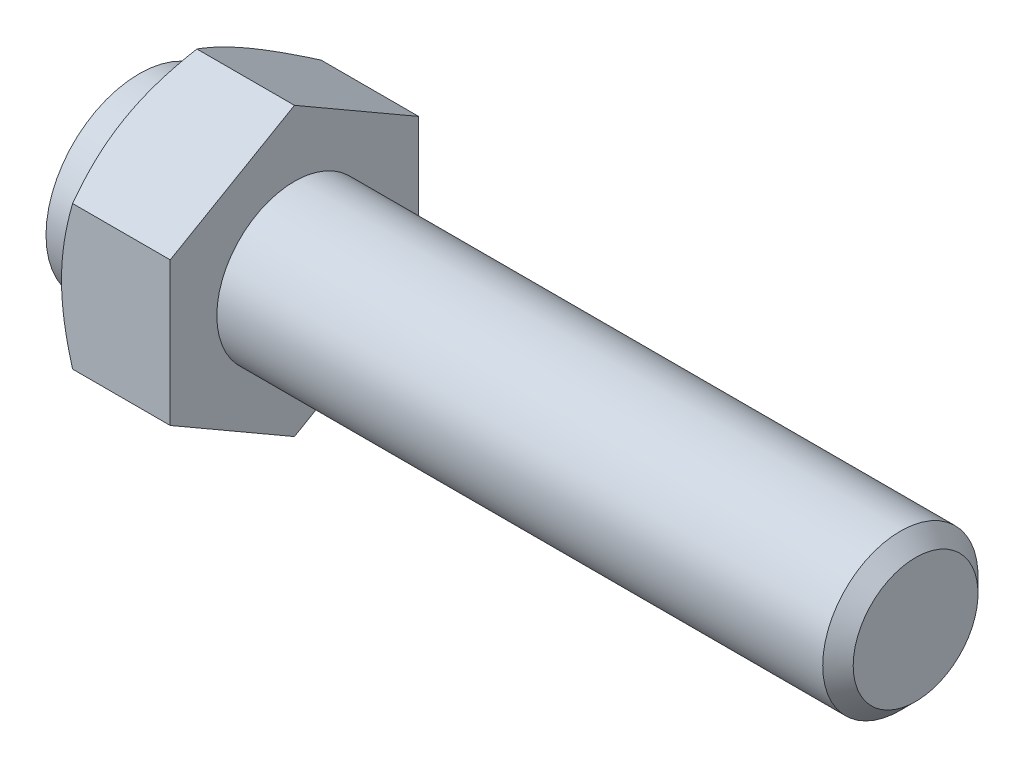
ISO-10303-21;
HEADER;
FILE_DESCRIPTION(('STEP AP214'),'2;1');
FILE_NAME('part.step','',(''),(''),'','','');
FILE_SCHEMA(('AUTOMOTIVE_DESIGN { 1 0 10303 214 1 1 1 1 }'));
ENDSEC;
DATA;
#1=APPLICATION_CONTEXT('core data for automotive mechanical design processes');
#2=APPLICATION_PROTOCOL_DEFINITION('international standard','automotive_design',2000,#1);
#3=PRODUCT_CONTEXT('',#1,'mechanical');
#4=PRODUCT('Part','Part','',(#3));
#5=PRODUCT_RELATED_PRODUCT_CATEGORY('part','',(#4));
#6=PRODUCT_DEFINITION_FORMATION('','',#4);
#7=PRODUCT_DEFINITION_CONTEXT('part definition',#1,'design');
#8=PRODUCT_DEFINITION('design','',#6,#7);
#9=PRODUCT_DEFINITION_SHAPE('','',#8);
#10=(LENGTH_UNIT() NAMED_UNIT(*) SI_UNIT(.MILLI.,.METRE.));
#11=(NAMED_UNIT(*) PLANE_ANGLE_UNIT() SI_UNIT($,.RADIAN.));
#12=(NAMED_UNIT(*) SI_UNIT($,.STERADIAN.) SOLID_ANGLE_UNIT());
#13=UNCERTAINTY_MEASURE_WITH_UNIT(LENGTH_MEASURE(1.E-05),#10,'distance_accuracy_value','');
#14=(GEOMETRIC_REPRESENTATION_CONTEXT(3) GLOBAL_UNCERTAINTY_ASSIGNED_CONTEXT((#13)) GLOBAL_UNIT_ASSIGNED_CONTEXT((#10,
#11,#12)) REPRESENTATION_CONTEXT('',''));
#15=CARTESIAN_POINT('',(0.,0.,0.));
#16=DIRECTION('',(0.,0.,1.));
#17=DIRECTION('',(1.,0.,0.));
#18=AXIS2_PLACEMENT_3D('',#15,#16,#17);
#19=CARTESIAN_POINT('',(-3.0381197846483,0.,0.));
#20=DIRECTION('',(1.,0.,0.));
#21=DIRECTION('',(0.,0.,-1.));
#22=AXIS2_PLACEMENT_3D('',#19,#20,#21);
#23=CONICAL_SURFACE('',#22,4.8,1.0471975511966);
#24=CARTESIAN_POINT('',(-1.57887075856018,-6.13939413294062,-4.));
#25=CARTESIAN_POINT('',(-1.66310456135238,-5.96521405575991,-4.));
#26=CARTESIAN_POINT('',(-1.74651196722149,-5.79062719131365,-4.));
#27=CARTESIAN_POINT('',(-1.91120786296766,-5.4404233088383,-4.));
#28=CARTESIAN_POINT('',(-1.99249600566285,-5.26480612772211,-4.));
#29=CARTESIAN_POINT('',(-2.15291001647983,-4.91138909620253,-4.));
#30=CARTESIAN_POINT('',(-2.23202112648226,-4.73358252336361,-4.));
#31=CARTESIAN_POINT('',(-2.38691919338497,-4.37653257309947,-4.));
#32=CARTESIAN_POINT('',(-2.46270631184629,-4.19728926600801,-4.));
#33=CARTESIAN_POINT('',(-2.61234069122834,-3.83154690304012,-4.));
#34=CARTESIAN_POINT('',(-2.68605704395078,-3.64499398861432,-4.));
#35=CARTESIAN_POINT('',(-2.82775411783597,-3.26968207246464,-4.));
#36=CARTESIAN_POINT('',(-2.89573418644737,-3.08092282252454,-4.));
#37=CARTESIAN_POINT('',(-3.02412704969833,-2.70127250879012,-4.));
#38=CARTESIAN_POINT('',(-3.08455573470301,-2.51038687463865,-4.));
#39=CARTESIAN_POINT('',(-3.19586469424676,-2.12587868357917,-4.));
#40=CARTESIAN_POINT('',(-3.24674804503767,-1.9322570301368,-4.));
#41=CARTESIAN_POINT('',(-3.33621571413744,-1.54322946382705,-4.));
#42=CARTESIAN_POINT('',(-3.37486428853927,-1.34783861004954,-4.));
#43=CARTESIAN_POINT('',(-3.43763422340833,-0.954695670395885,-4.));
#44=CARTESIAN_POINT('',(-3.46175683200502,-0.756943788878231,-4.));
#45=CARTESIAN_POINT('',(-3.49323359916261,-0.362621629692277,-4.));
#46=CARTESIAN_POINT('',(-3.50079822453623,-0.166068575033682,-4.));
#47=CARTESIAN_POINT('',(-3.49906790973023,0.226977102826042,-4.));
#48=CARTESIAN_POINT('',(-3.48977250832793,0.423469724226887,-4.));
#49=CARTESIAN_POINT('',(-3.4601531531514,0.758990273736847,-4.));
#50=CARTESIAN_POINT('',(-3.4437429725596,0.898383211053859,-4.));
#51=CARTESIAN_POINT('',(-3.40349476320339,1.176100092079,-4.));
#52=CARTESIAN_POINT('',(-3.37965566898105,1.31442387953113,-4.));
#53=CARTESIAN_POINT('',(-3.29825326079294,1.72763495504875,-4.));
#54=CARTESIAN_POINT('',(-3.23082125051095,2.00059716271885,-4.));
#55=CARTESIAN_POINT('',(-3.11451374843233,2.40866187771309,-4.));
#56=CARTESIAN_POINT('',(-3.07269287237421,2.54589494973043,-4.));
#57=CARTESIAN_POINT('',(-2.98486276665558,2.81902707997841,-4.));
#58=CARTESIAN_POINT('',(-2.93885351028714,2.9549261296963,-4.));
#59=CARTESIAN_POINT('',(-2.8433720179148,3.2254363287352,-4.));
#60=CARTESIAN_POINT('',(-2.79390102621893,3.36004792125236,-4.));
#61=CARTESIAN_POINT('',(-2.69206223773492,3.62816633823096,-4.));
#62=CARTESIAN_POINT('',(-2.63969446772329,3.76167317289117,-4.));
#63=CARTESIAN_POINT('',(-2.51762334906242,4.06475987665193,-4.));
#64=CARTESIAN_POINT('',(-2.447153932986,4.23403057744386,-4.));
#65=CARTESIAN_POINT('',(-2.30305911863712,4.57122630399105,-4.));
#66=CARTESIAN_POINT('',(-2.2294335680974,4.73915126435629,-4.));
#67=CARTESIAN_POINT('',(-2.00475288292283,5.24128493973559,-4.));
#68=CARTESIAN_POINT('',(-1.84991548479837,5.57379958004734,-4.));
#69=CARTESIAN_POINT('',(-1.53341711594573,6.2358945685597,-4.));
#70=CARTESIAN_POINT('',(-1.37175021882607,6.56547205474272,-4.));
#71=CARTESIAN_POINT('',(-1.04374298683518,7.22230103495156,-4.));
#72=CARTESIAN_POINT('',(-0.877402497289283,7.54955245154488,-4.));
#73=CARTESIAN_POINT('',(-0.5544646914537,8.17689265348599,-4.));
#74=CARTESIAN_POINT('',(-0.398118172737156,8.4771109692077,-4.));
#75=CARTESIAN_POINT('',(-0.0832622099771552,9.07642118538341,-4.));
#76=CARTESIAN_POINT('',(0.0752472970322567,9.375513052721,-4.));
#77=CARTESIAN_POINT('',(0.393577197351759,9.97215228024382,-4.));
#78=CARTESIAN_POINT('',(0.553393940840393,10.2697015905905,-4.));
#79=CARTESIAN_POINT('',(0.874341146801551,10.8640723738864,-4.));
#80=CARTESIAN_POINT('',(1.03547154464301,11.1608938817197,-4.));
#81=CARTESIAN_POINT('',(1.19709645417553,11.4574439973737,-4.));
#82=B_SPLINE_CURVE_WITH_KNOTS('',3,(#24,#25,#26,#27,#28,#29,#30,#31,#32,#33,#34,#35,#36,#37,#38,
#39,#40,#41,#42,#43,#44,#45,#46,#47,#48,#49,#50,#51,#52,#53,#54,#55,#56,#57,#58,#59,#60,#61,#62,
#63,#64,#65,#66,#67,#68,#69,#70,#71,#72,#73,#74,#75,#76,#77,#78,#79,#80,#81),.UNSPECIFIED.,.F.,
.F.,(4,2,2,2,2,2,2,2,2,2,2,2,2,2,2,2,2,2,2,2,2,2,2,2,2,2,2,2,4),(0.,0.580443710282804,
1.16098191997214,1.74479005581555,2.32856978442475,2.93026499507169,3.5320285616732,
4.13250371575107,4.73278501614091,5.32985927078347,5.92688221507966,6.51627129067316,
7.10567648982992,7.52653774537938,7.94745938882889,8.78979727003887,9.2201547358638,
9.65051494613078,10.0807212518396,10.5109235815821,11.0609419553601,11.610986894627,
12.7112482185919,13.8124847525737,14.9137577755076,15.9292165443316,16.9447049371325,
17.957959920125,18.9711653488122),.UNSPECIFIED.);
#83=CARTESIAN_POINT('',(-3.14273441009184,-2.3094010767585,-4.));
#84=VERTEX_POINT('',#83);
#85=CARTESIAN_POINT('',(-3.5,0.,-4.));
#86=VERTEX_POINT('',#85);
#87=EDGE_CURVE('E203',#84,#86,#82,.T.);
#88=ORIENTED_EDGE('',*,*,#87,.F.);
#89=CARTESIAN_POINT('',(-3.14266774092523,-4.61891762357084,0.000200000000000038));
#90=CARTESIAN_POINT('',(-3.20128212635172,-4.5174314838138,-0.175579150323228));
#91=CARTESIAN_POINT('',(-3.25458967853774,-4.41506932144052,-0.352875616326381));
#92=CARTESIAN_POINT('',(-3.3476383292536,-4.20857250547739,-0.710538593175707));
#93=CARTESIAN_POINT('',(-3.3873465109703,-4.10443418285647,-0.890911458970152));
#94=CARTESIAN_POINT('',(-3.44915778471972,-3.89744813015756,-1.24942181870279));
#95=CARTESIAN_POINT('',(-3.47167226847711,-3.79463224655059,-1.42750415293514));
#96=CARTESIAN_POINT('',(-3.49854937685342,-3.58851671999023,-1.78450671716651));
#97=CARTESIAN_POINT('',(-3.50293425857306,-3.48521782616117,-1.9634256496441));
#98=CARTESIAN_POINT('',(-3.49380992706003,-3.29219970504619,-2.29774284219673));
#99=CARTESIAN_POINT('',(-3.48254104601201,-3.20245157692486,-2.45319115998707));
#100=CARTESIAN_POINT('',(-3.44682600920181,-3.02354002635497,-2.76307505563506));
#101=CARTESIAN_POINT('',(-3.42236765428847,-2.93437722268073,-2.91750956174413));
#102=CARTESIAN_POINT('',(-3.36122393508071,-2.75509682012354,-3.22803232777458));
#103=CARTESIAN_POINT('',(-3.32427939634514,-2.6650019108942,-3.3840812880631));
#104=CARTESIAN_POINT('',(-3.24042992745197,-2.48615580200001,-3.69385183540384));
#105=CARTESIAN_POINT('',(-3.19354469778726,-2.39740231122585,-3.84757739077378));
#106=CARTESIAN_POINT('',(-3.14266774092523,-2.30928560670467,-4.0002));
#107=B_SPLINE_CURVE_WITH_KNOTS('',3,(#89,#90,#91,#92,#93,#94,#95,#96,#97,#98,#99,#100,#101,#102,
#103,#104,#105,#106),.UNSPECIFIED.,.F.,.F.,(4,2,2,2,2,2,2,2,4),(0.,0.634047835695967,
1.26961969224544,1.88946157213122,2.50854226669297,3.04757825393386,3.58711366126903,
4.13861653143764,4.68903648037743),.UNSPECIFIED.);
#108=CARTESIAN_POINT('',(-3.5,-3.46410161513776,-2.));
#109=VERTEX_POINT('',#108);
#110=EDGE_CURVE('E182',#109,#84,#107,.T.);
#111=ORIENTED_EDGE('',*,*,#110,.F.);
#112=CARTESIAN_POINT('',(-3.5,0.,0.));
#113=DIRECTION('',(-1.,0.,0.));
#114=DIRECTION('',(0.,0.,1.));
#115=AXIS2_PLACEMENT_3D('',#112,#113,#114);
#116=CIRCLE('',#115,4.);
#117=EDGE_CURVE('E288',#86,#109,#116,.T.);
#118=ORIENTED_EDGE('',*,*,#117,.F.);
#119=EDGE_LOOP('',(#88,#111,#118));
#120=FACE_BOUND('',#119,.T.);
#121=ADVANCED_FACE('F38',(#120),#23,.T.);
#122=CARTESIAN_POINT('',(-3.14273441009184,2.3094010767585,-4.));
#123=VERTEX_POINT('',#122);
#124=EDGE_CURVE('E189',#86,#123,#82,.T.);
#125=ORIENTED_EDGE('',*,*,#124,.F.);
#126=CARTESIAN_POINT('',(-3.5,3.46410161513776,-2.));
#127=VERTEX_POINT('',#126);
#128=EDGE_CURVE('E287',#127,#86,#116,.T.);
#129=ORIENTED_EDGE('',*,*,#128,.F.);
#130=CARTESIAN_POINT('',(-3.14266774092523,2.30928560670467,-4.0002));
#131=CARTESIAN_POINT('',(-3.20128212635172,2.41077174646171,-3.82442084967677));
#132=CARTESIAN_POINT('',(-3.25458967853774,2.513133908835,-3.64712438367362));
#133=CARTESIAN_POINT('',(-3.3476383292536,2.71963072479812,-3.28946140682429));
#134=CARTESIAN_POINT('',(-3.3873465109703,2.82376904741904,-3.10908854102985));
#135=CARTESIAN_POINT('',(-3.44915778471972,3.03075510011795,-2.75057818129721));
#136=CARTESIAN_POINT('',(-3.47167226847711,3.13357098372492,-2.57249584706486));
#137=CARTESIAN_POINT('',(-3.49854937685342,3.33968651028528,-2.21549328283349));
#138=CARTESIAN_POINT('',(-3.50293425857306,3.44298540411434,-2.0365743503559));
#139=CARTESIAN_POINT('',(-3.49380992706003,3.63600352522932,-1.70225715780327));
#140=CARTESIAN_POINT('',(-3.48254104601201,3.72575165335065,-1.54680884001293));
#141=CARTESIAN_POINT('',(-3.44682600920181,3.90466320392054,-1.23692494436494));
#142=CARTESIAN_POINT('',(-3.42236765428847,3.99382600759478,-1.08249043825587));
#143=CARTESIAN_POINT('',(-3.36122393508071,4.17310641015197,-0.771967672225422));
#144=CARTESIAN_POINT('',(-3.32427939634514,4.26320131938131,-0.615918711936898));
#145=CARTESIAN_POINT('',(-3.24042992745197,4.4420474282755,-0.306148164596161));
#146=CARTESIAN_POINT('',(-3.19354469778726,4.53080091904966,-0.15242260922622));
#147=CARTESIAN_POINT('',(-3.14266774092523,4.61891762357084,0.00019999999999985));
#148=B_SPLINE_CURVE_WITH_KNOTS('',3,(#130,#131,#132,#133,#134,#135,#136,#137,#138,#139,#140,
#141,#142,#143,#144,#145,#146,#147),.UNSPECIFIED.,.F.,.F.,(4,2,2,2,2,2,2,2,4),(0.,
0.634047835695967,1.26961969224543,1.88946157213122,2.50854226669297,3.04757825393386,
3.58711366126903,4.13861653143764,4.68903648037743),.UNSPECIFIED.);
#149=EDGE_CURVE('E202',#123,#127,#148,.T.);
#150=ORIENTED_EDGE('',*,*,#149,.F.);
#151=EDGE_LOOP('',(#125,#129,#150));
#152=FACE_BOUND('',#151,.T.);
#153=ADVANCED_FACE('F171',(#152),#23,.T.);
#154=CARTESIAN_POINT('',(-3.14273441009184,4.61880215351701,0.));
#155=VERTEX_POINT('',#154);
#156=EDGE_CURVE('E196',#127,#155,#148,.T.);
#157=ORIENTED_EDGE('',*,*,#156,.F.);
#158=CARTESIAN_POINT('',(-3.5,3.46410161513776,2.));
#159=VERTEX_POINT('',#158);
#160=EDGE_CURVE('E263',#159,#127,#116,.T.);
#161=ORIENTED_EDGE('',*,*,#160,.F.);
#162=CARTESIAN_POINT('',(-3.14266774092523,4.61891762357084,-0.000200000000000038));
#163=CARTESIAN_POINT('',(-3.20128212635172,4.5174314838138,0.175579150323228));
#164=CARTESIAN_POINT('',(-3.25458967853774,4.41506932144052,0.352875616326381));
#165=CARTESIAN_POINT('',(-3.3476383292536,4.20857250547739,0.710538593175707));
#166=CARTESIAN_POINT('',(-3.3873465109703,4.10443418285647,0.890911458970152));
#167=CARTESIAN_POINT('',(-3.44915778471972,3.89744813015756,1.24942181870279));
#168=CARTESIAN_POINT('',(-3.47167226847711,3.79463224655059,1.42750415293514));
#169=CARTESIAN_POINT('',(-3.49854937685342,3.58851671999023,1.78450671716651));
#170=CARTESIAN_POINT('',(-3.50293425857306,3.48521782616117,1.9634256496441));
#171=CARTESIAN_POINT('',(-3.49380992706003,3.29219970504619,2.29774284219673));
#172=CARTESIAN_POINT('',(-3.48254104601201,3.20245157692486,2.45319115998707));
#173=CARTESIAN_POINT('',(-3.44682600920181,3.02354002635497,2.76307505563506));
#174=CARTESIAN_POINT('',(-3.42236765428847,2.93437722268073,2.91750956174413));
#175=CARTESIAN_POINT('',(-3.36122393508071,2.75509682012354,3.22803232777458));
#176=CARTESIAN_POINT('',(-3.32427939634514,2.6650019108942,3.3840812880631));
#177=CARTESIAN_POINT('',(-3.24042992745197,2.48615580200001,3.69385183540384));
#178=CARTESIAN_POINT('',(-3.19354469778726,2.39740231122585,3.84757739077378));
#179=CARTESIAN_POINT('',(-3.14266774092523,2.30928560670467,4.0002));
#180=B_SPLINE_CURVE_WITH_KNOTS('',3,(#162,#163,#164,#165,#166,#167,#168,#169,#170,#171,#172,
#173,#174,#175,#176,#177,#178,#179),.UNSPECIFIED.,.F.,.F.,(4,2,2,2,2,2,2,2,4),(0.,
0.634047835695967,1.26961969224544,1.88946157213122,2.50854226669297,3.04757825393386,
3.58711366126903,4.13861653143764,4.68903648037743),.UNSPECIFIED.);
#181=EDGE_CURVE('E259',#155,#159,#180,.T.);
#182=ORIENTED_EDGE('',*,*,#181,.F.);
#183=EDGE_LOOP('',(#157,#161,#182));
#184=FACE_BOUND('',#183,.T.);
#185=ADVANCED_FACE('F285',(#184),#23,.T.);
#186=CARTESIAN_POINT('',(-3.14273441009184,-4.61880215351701,0.));
#187=VERTEX_POINT('',#186);
#188=EDGE_CURVE('E295',#187,#109,#107,.T.);
#189=ORIENTED_EDGE('',*,*,#188,.F.);
#190=CARTESIAN_POINT('',(-3.14266774092523,-2.30928560670467,4.0002));
#191=CARTESIAN_POINT('',(-3.20128212635172,-2.41077174646171,3.82442084967677));
#192=CARTESIAN_POINT('',(-3.25458967853774,-2.513133908835,3.64712438367362));
#193=CARTESIAN_POINT('',(-3.3476383292536,-2.71963072479812,3.28946140682429));
#194=CARTESIAN_POINT('',(-3.3873465109703,-2.82376904741904,3.10908854102985));
#195=CARTESIAN_POINT('',(-3.44915778471972,-3.03075510011795,2.75057818129721));
#196=CARTESIAN_POINT('',(-3.47167226847711,-3.13357098372492,2.57249584706486));
#197=CARTESIAN_POINT('',(-3.49854937685342,-3.33968651028528,2.21549328283349));
#198=CARTESIAN_POINT('',(-3.50293425857306,-3.44298540411434,2.0365743503559));
#199=CARTESIAN_POINT('',(-3.49380992706003,-3.63600352522932,1.70225715780327));
#200=CARTESIAN_POINT('',(-3.48254104601201,-3.72575165335065,1.54680884001293));
#201=CARTESIAN_POINT('',(-3.44682600920181,-3.90466320392054,1.23692494436494));
#202=CARTESIAN_POINT('',(-3.42236765428847,-3.99382600759478,1.08249043825587));
#203=CARTESIAN_POINT('',(-3.36122393508071,-4.17310641015197,0.771967672225422));
#204=CARTESIAN_POINT('',(-3.32427939634514,-4.26320131938131,0.615918711936898));
#205=CARTESIAN_POINT('',(-3.24042992745197,-4.4420474282755,0.306148164596161));
#206=CARTESIAN_POINT('',(-3.19354469778726,-4.53080091904966,0.15242260922622));
#207=CARTESIAN_POINT('',(-3.14266774092523,-4.61891762357084,-0.00019999999999985));
#208=B_SPLINE_CURVE_WITH_KNOTS('',3,(#190,#191,#192,#193,#194,#195,#196,#197,#198,#199,#200,
#201,#202,#203,#204,#205,#206,#207),.UNSPECIFIED.,.F.,.F.,(4,2,2,2,2,2,2,2,4),(0.,
0.634047835695967,1.26961969224543,1.88946157213122,2.50854226669297,3.04757825393386,
3.58711366126903,4.13861653143764,4.68903648037743),.UNSPECIFIED.);
#209=CARTESIAN_POINT('',(-3.5,-3.46410161513776,2.));
#210=VERTEX_POINT('',#209);
#211=EDGE_CURVE('E113',#210,#187,#208,.T.);
#212=ORIENTED_EDGE('',*,*,#211,.F.);
#213=EDGE_CURVE('E290',#109,#210,#116,.T.);
#214=ORIENTED_EDGE('',*,*,#213,.F.);
#215=EDGE_LOOP('',(#189,#212,#214));
#216=FACE_BOUND('',#215,.T.);
#217=ADVANCED_FACE('F294',(#216),#23,.T.);
#218=CARTESIAN_POINT('',(-3.14273441009184,2.3094010767585,4.));
#219=VERTEX_POINT('',#218);
#220=EDGE_CURVE('E204',#159,#219,#180,.T.);
#221=ORIENTED_EDGE('',*,*,#220,.F.);
#222=CARTESIAN_POINT('',(-3.5,0.,4.));
#223=VERTEX_POINT('',#222);
#224=EDGE_CURVE('E261',#223,#159,#116,.T.);
#225=ORIENTED_EDGE('',*,*,#224,.F.);
#226=CARTESIAN_POINT('',(-1.57887075856018,-6.13939413294062,4.));
#227=CARTESIAN_POINT('',(-1.66310456135238,-5.96521405575991,4.));
#228=CARTESIAN_POINT('',(-1.74651196722149,-5.79062719131365,4.));
#229=CARTESIAN_POINT('',(-1.91120786296766,-5.4404233088383,4.));
#230=CARTESIAN_POINT('',(-1.99249600566285,-5.26480612772211,4.));
#231=CARTESIAN_POINT('',(-2.15291001647983,-4.91138909620253,4.));
#232=CARTESIAN_POINT('',(-2.23202112648226,-4.73358252336361,4.));
#233=CARTESIAN_POINT('',(-2.38691919338497,-4.37653257309947,4.));
#234=CARTESIAN_POINT('',(-2.46270631184629,-4.19728926600801,4.));
#235=CARTESIAN_POINT('',(-2.61234069122834,-3.83154690304012,4.));
#236=CARTESIAN_POINT('',(-2.68605704395078,-3.64499398861432,4.));
#237=CARTESIAN_POINT('',(-2.82775411783597,-3.26968207246464,4.));
#238=CARTESIAN_POINT('',(-2.89573418644737,-3.08092282252454,4.));
#239=CARTESIAN_POINT('',(-3.02412704969833,-2.70127250879012,4.));
#240=CARTESIAN_POINT('',(-3.08455573470301,-2.51038687463865,4.));
#241=CARTESIAN_POINT('',(-3.19586469424676,-2.12587868357917,4.));
#242=CARTESIAN_POINT('',(-3.24674804503767,-1.9322570301368,4.));
#243=CARTESIAN_POINT('',(-3.33621571413744,-1.54322946382705,4.));
#244=CARTESIAN_POINT('',(-3.37486428853927,-1.34783861004954,4.));
#245=CARTESIAN_POINT('',(-3.43763422340833,-0.954695670395885,4.));
#246=CARTESIAN_POINT('',(-3.46175683200502,-0.756943788878231,4.));
#247=CARTESIAN_POINT('',(-3.49323359916261,-0.362621629692277,4.));
#248=CARTESIAN_POINT('',(-3.50079822453623,-0.166068575033682,4.));
#249=CARTESIAN_POINT('',(-3.49906790973023,0.226977102826042,4.));
#250=CARTESIAN_POINT('',(-3.48977250832793,0.423469724226887,4.));
#251=CARTESIAN_POINT('',(-3.4601531531514,0.758990273736847,4.));
#252=CARTESIAN_POINT('',(-3.4437429725596,0.898383211053859,4.));
#253=CARTESIAN_POINT('',(-3.40349476320339,1.176100092079,4.));
#254=CARTESIAN_POINT('',(-3.37965566898105,1.31442387953113,4.));
#255=CARTESIAN_POINT('',(-3.29825326079294,1.72763495504875,4.));
#256=CARTESIAN_POINT('',(-3.23082125051095,2.00059716271885,4.));
#257=CARTESIAN_POINT('',(-3.11451374843233,2.40866187771309,4.));
#258=CARTESIAN_POINT('',(-3.07269287237421,2.54589494973043,4.));
#259=CARTESIAN_POINT('',(-2.98486276665558,2.81902707997841,4.));
#260=CARTESIAN_POINT('',(-2.93885351028714,2.9549261296963,4.));
#261=CARTESIAN_POINT('',(-2.8433720179148,3.2254363287352,4.));
#262=CARTESIAN_POINT('',(-2.79390102621893,3.36004792125236,4.));
#263=CARTESIAN_POINT('',(-2.69206223773492,3.62816633823096,4.));
#264=CARTESIAN_POINT('',(-2.63969446772329,3.76167317289117,4.));
#265=CARTESIAN_POINT('',(-2.51762334906242,4.06475987665193,4.));
#266=CARTESIAN_POINT('',(-2.447153932986,4.23403057744386,4.));
#267=CARTESIAN_POINT('',(-2.30305911863712,4.57122630399105,4.));
#268=CARTESIAN_POINT('',(-2.2294335680974,4.73915126435629,4.));
#269=CARTESIAN_POINT('',(-2.00475288292283,5.24128493973559,4.));
#270=CARTESIAN_POINT('',(-1.84991548479837,5.57379958004734,4.));
#271=CARTESIAN_POINT('',(-1.53341711594573,6.2358945685597,4.));
#272=CARTESIAN_POINT('',(-1.37175021882607,6.56547205474272,4.));
#273=CARTESIAN_POINT('',(-1.04374298683518,7.22230103495156,4.));
#274=CARTESIAN_POINT('',(-0.877402497289283,7.54955245154488,4.));
#275=CARTESIAN_POINT('',(-0.5544646914537,8.17689265348599,4.));
#276=CARTESIAN_POINT('',(-0.398118172737156,8.4771109692077,4.));
#277=CARTESIAN_POINT('',(-0.0832622099771552,9.07642118538341,4.));
#278=CARTESIAN_POINT('',(0.0752472970322567,9.375513052721,4.));
#279=CARTESIAN_POINT('',(0.393577197351759,9.97215228024382,4.));
#280=CARTESIAN_POINT('',(0.553393940840393,10.2697015905905,4.));
#281=CARTESIAN_POINT('',(0.874341146801551,10.8640723738864,4.));
#282=CARTESIAN_POINT('',(1.03547154464301,11.1608938817197,4.));
#283=CARTESIAN_POINT('',(1.19709645417553,11.4574439973737,4.));
#284=B_SPLINE_CURVE_WITH_KNOTS('',3,(#226,#227,#228,#229,#230,#231,#232,#233,#234,#235,#236,
#237,#238,#239,#240,#241,#242,#243,#244,#245,#246,#247,#248,#249,#250,#251,#252,#253,#254,#255,
#256,#257,#258,#259,#260,#261,#262,#263,#264,#265,#266,#267,#268,#269,#270,#271,#272,#273,#274,
#275,#276,#277,#278,#279,#280,#281,#282,#283),.UNSPECIFIED.,.F.,.F.,(4,2,2,2,2,2,2,2,2,2,2,2,2,
2,2,2,2,2,2,2,2,2,2,2,2,2,2,2,4),(0.,0.580443710282804,1.16098191997214,1.74479005581555,
2.32856978442475,2.93026499507169,3.5320285616732,4.13250371575107,4.73278501614091,
5.32985927078347,5.92688221507966,6.51627129067316,7.10567648982992,7.52653774537938,
7.94745938882889,8.78979727003887,9.2201547358638,9.65051494613078,10.0807212518396,
10.5109235815821,11.0609419553601,11.610986894627,12.7112482185919,13.8124847525737,
14.9137577755076,15.9292165443316,16.9447049371325,17.957959920125,18.9711653488122),.UNSPECIFIED.);
#285=EDGE_CURVE('E53',#219,#223,#284,.F.);
#286=ORIENTED_EDGE('',*,*,#285,.F.);
#287=EDGE_LOOP('',(#221,#225,#286));
#288=FACE_BOUND('',#287,.T.);
#289=ADVANCED_FACE('F280',(#288),#23,.T.);
#290=CARTESIAN_POINT('',(-3.14273441009184,-2.3094010767585,4.));
#291=VERTEX_POINT('',#290);
#292=EDGE_CURVE('E296',#291,#210,#208,.T.);
#293=ORIENTED_EDGE('',*,*,#292,.F.);
#294=EDGE_CURVE('E145',#223,#291,#284,.F.);
#295=ORIENTED_EDGE('',*,*,#294,.F.);
#296=EDGE_CURVE('E256',#210,#223,#116,.T.);
#297=ORIENTED_EDGE('',*,*,#296,.F.);
#298=EDGE_LOOP('',(#293,#295,#297));
#299=FACE_BOUND('',#298,.T.);
#300=ADVANCED_FACE('F173',(#299),#23,.T.);
#301=CARTESIAN_POINT('',(-5.,0.,0.));
#302=DIRECTION('',(1.,0.,0.));
#303=DIRECTION('',(0.,0.,-1.));
#304=AXIS2_PLACEMENT_3D('',#301,#302,#303);
#305=PLANE('',#304);
#306=CARTESIAN_POINT('',(-5.,0.,0.));
#307=DIRECTION('',(-1.,0.,0.));
#308=DIRECTION('',(0.,0.,1.));
#309=AXIS2_PLACEMENT_3D('',#306,#307,#308);
#310=CIRCLE('',#309,3.);
#311=CARTESIAN_POINT('',(-5.,0.,3.));
#312=VERTEX_POINT('',#311);
#313=EDGE_CURVE('E11',#312,#312,#310,.T.);
#314=ORIENTED_EDGE('',*,*,#313,.T.);
#315=EDGE_LOOP('',(#314));
#316=FACE_BOUND('',#315,.T.);
#317=ADVANCED_FACE('F40',(#316),#305,.F.);
#318=CARTESIAN_POINT('',(20.,0.,0.));
#319=DIRECTION('',(-1.,0.,0.));
#320=DIRECTION('',(0.,0.,1.));
#321=AXIS2_PLACEMENT_3D('',#318,#319,#320);
#322=CYLINDRICAL_SURFACE('',#321,3.);
#323=ORIENTED_EDGE('',*,*,#313,.F.);
#324=EDGE_LOOP('',(#323));
#325=FACE_BOUND('',#324,.T.);
#326=CARTESIAN_POINT('',(-3.5,0.,0.));
#327=DIRECTION('',(-1.,0.,0.));
#328=DIRECTION('',(0.,0.,1.));
#329=AXIS2_PLACEMENT_3D('',#326,#327,#328);
#330=CIRCLE('',#329,3.);
#331=CARTESIAN_POINT('',(-3.5,0.,3.));
#332=VERTEX_POINT('',#331);
#333=EDGE_CURVE('E46',#332,#332,#330,.T.);
#334=ORIENTED_EDGE('',*,*,#333,.T.);
#335=EDGE_LOOP('',(#334));
#336=FACE_BOUND('',#335,.T.);
#337=ADVANCED_FACE('F267',(#325,#336),#322,.T.);
#338=CARTESIAN_POINT('',(-3.5,3.,0.));
#339=DIRECTION('',(1.,0.,0.));
#340=DIRECTION('',(0.,0.,-1.));
#341=AXIS2_PLACEMENT_3D('',#338,#339,#340);
#342=PLANE('',#341);
#343=ORIENTED_EDGE('',*,*,#333,.F.);
#344=EDGE_LOOP('',(#343));
#345=FACE_BOUND('',#344,.T.);
#346=ORIENTED_EDGE('',*,*,#224,.T.);
#347=ORIENTED_EDGE('',*,*,#160,.T.);
#348=ORIENTED_EDGE('',*,*,#128,.T.);
#349=ORIENTED_EDGE('',*,*,#117,.T.);
#350=ORIENTED_EDGE('',*,*,#213,.T.);
#351=ORIENTED_EDGE('',*,*,#296,.T.);
#352=EDGE_LOOP('',(#346,#347,#348,#349,#350,#351));
#353=FACE_BOUND('',#352,.T.);
#354=ADVANCED_FACE('F175',(#345,#353),#342,.F.);
#355=CARTESIAN_POINT('',(-5.,4.61880215351701,0.));
#356=DIRECTION('',(0.,0.866025403784439,0.5));
#357=DIRECTION('',(0.,-0.5,0.866025403784439));
#358=AXIS2_PLACEMENT_3D('',#355,#356,#357);
#359=PLANE('',#358);
#360=ORIENTED_EDGE('',*,*,#181,.T.);
#361=ORIENTED_EDGE('',*,*,#220,.T.);
#362=DIRECTION('',(1.,0.,0.));
#363=VECTOR('',#362,1.);
#364=CARTESIAN_POINT('',(-5.,2.3094010767585,4.));
#365=LINE('',#364,#363);
#366=CARTESIAN_POINT('',(0.,2.3094010767585,4.));
#367=VERTEX_POINT('',#366);
#368=EDGE_CURVE('E142',#219,#367,#365,.T.);
#369=ORIENTED_EDGE('',*,*,#368,.T.);
#370=DIRECTION('',(0.,-0.5,0.866025403784439));
#371=VECTOR('',#370,1.);
#372=CARTESIAN_POINT('',(0.,4.61880215351701,0.));
#373=LINE('',#372,#371);
#374=CARTESIAN_POINT('',(0.,4.61880215351701,0.));
#375=VERTEX_POINT('',#374);
#376=EDGE_CURVE('E134',#375,#367,#373,.T.);
#377=ORIENTED_EDGE('',*,*,#376,.F.);
#378=DIRECTION('',(1.,0.,0.));
#379=VECTOR('',#378,1.);
#380=CARTESIAN_POINT('',(-5.,4.61880215351701,0.));
#381=LINE('',#380,#379);
#382=EDGE_CURVE('E143',#155,#375,#381,.T.);
#383=ORIENTED_EDGE('',*,*,#382,.F.);
#384=EDGE_LOOP('',(#360,#361,#369,#377,#383));
#385=FACE_BOUND('',#384,.T.);
#386=ADVANCED_FACE('F214',(#385),#359,.T.);
#387=CARTESIAN_POINT('',(-5.,2.3094010767585,-4.));
#388=DIRECTION('',(0.,0.866025403784439,-0.5));
#389=DIRECTION('',(0.,0.5,0.866025403784439));
#390=AXIS2_PLACEMENT_3D('',#387,#388,#389);
#391=PLANE('',#390);
#392=ORIENTED_EDGE('',*,*,#149,.T.);
#393=ORIENTED_EDGE('',*,*,#156,.T.);
#394=ORIENTED_EDGE('',*,*,#382,.T.);
#395=DIRECTION('',(0.,0.5,0.866025403784439));
#396=VECTOR('',#395,1.);
#397=CARTESIAN_POINT('',(0.,2.3094010767585,-4.));
#398=LINE('',#397,#396);
#399=CARTESIAN_POINT('',(0.,2.3094010767585,-4.));
#400=VERTEX_POINT('',#399);
#401=EDGE_CURVE('E139',#400,#375,#398,.T.);
#402=ORIENTED_EDGE('',*,*,#401,.F.);
#403=DIRECTION('',(1.,0.,0.));
#404=VECTOR('',#403,1.);
#405=CARTESIAN_POINT('',(-5.,2.3094010767585,-4.));
#406=LINE('',#405,#404);
#407=EDGE_CURVE('E146',#123,#400,#406,.T.);
#408=ORIENTED_EDGE('',*,*,#407,.F.);
#409=EDGE_LOOP('',(#392,#393,#394,#402,#408));
#410=FACE_BOUND('',#409,.T.);
#411=ADVANCED_FACE('F210',(#410),#391,.T.);
#412=CARTESIAN_POINT('',(-5.,-2.3094010767585,-4.));
#413=DIRECTION('',(0.,0.,-1.));
#414=DIRECTION('',(-1.,0.,0.));
#415=AXIS2_PLACEMENT_3D('',#412,#413,#414);
#416=PLANE('',#415);
#417=ORIENTED_EDGE('',*,*,#87,.T.);
#418=ORIENTED_EDGE('',*,*,#124,.T.);
#419=ORIENTED_EDGE('',*,*,#407,.T.);
#420=DIRECTION('',(0.,1.,0.));
#421=VECTOR('',#420,1.);
#422=CARTESIAN_POINT('',(0.,-2.3094010767585,-4.));
#423=LINE('',#422,#421);
#424=CARTESIAN_POINT('',(0.,-2.3094010767585,-4.));
#425=VERTEX_POINT('',#424);
#426=EDGE_CURVE('E126',#425,#400,#423,.T.);
#427=ORIENTED_EDGE('',*,*,#426,.F.);
#428=DIRECTION('',(1.,0.,0.));
#429=VECTOR('',#428,1.);
#430=CARTESIAN_POINT('',(-5.,-2.3094010767585,-4.));
#431=LINE('',#430,#429);
#432=EDGE_CURVE('E116',#84,#425,#431,.T.);
#433=ORIENTED_EDGE('',*,*,#432,.F.);
#434=EDGE_LOOP('',(#417,#418,#419,#427,#433));
#435=FACE_BOUND('',#434,.T.);
#436=ADVANCED_FACE('F213',(#435),#416,.T.);
#437=CARTESIAN_POINT('',(-5.,-4.61880215351701,0.));
#438=DIRECTION('',(0.,-0.866025403784439,-0.5));
#439=DIRECTION('',(0.,0.5,-0.866025403784439));
#440=AXIS2_PLACEMENT_3D('',#437,#438,#439);
#441=PLANE('',#440);
#442=ORIENTED_EDGE('',*,*,#188,.T.);
#443=ORIENTED_EDGE('',*,*,#110,.T.);
#444=ORIENTED_EDGE('',*,*,#432,.T.);
#445=DIRECTION('',(0.,0.5,-0.866025403784439));
#446=VECTOR('',#445,1.);
#447=CARTESIAN_POINT('',(0.,-4.61880215351701,0.));
#448=LINE('',#447,#446);
#449=CARTESIAN_POINT('',(0.,-4.61880215351701,0.));
#450=VERTEX_POINT('',#449);
#451=EDGE_CURVE('E120',#450,#425,#448,.T.);
#452=ORIENTED_EDGE('',*,*,#451,.F.);
#453=DIRECTION('',(1.,0.,0.));
#454=VECTOR('',#453,1.);
#455=CARTESIAN_POINT('',(-5.,-4.61880215351701,0.));
#456=LINE('',#455,#454);
#457=EDGE_CURVE('E109',#187,#450,#456,.T.);
#458=ORIENTED_EDGE('',*,*,#457,.F.);
#459=EDGE_LOOP('',(#442,#443,#444,#452,#458));
#460=FACE_BOUND('',#459,.T.);
#461=ADVANCED_FACE('F121',(#460),#441,.T.);
#462=CARTESIAN_POINT('',(-5.,-2.3094010767585,4.));
#463=DIRECTION('',(0.,-0.866025403784439,0.5));
#464=DIRECTION('',(0.,-0.5,-0.866025403784439));
#465=AXIS2_PLACEMENT_3D('',#462,#463,#464);
#466=PLANE('',#465);
#467=ORIENTED_EDGE('',*,*,#292,.T.);
#468=ORIENTED_EDGE('',*,*,#211,.T.);
#469=ORIENTED_EDGE('',*,*,#457,.T.);
#470=DIRECTION('',(0.,-0.5,-0.866025403784439));
#471=VECTOR('',#470,1.);
#472=CARTESIAN_POINT('',(0.,-2.3094010767585,4.));
#473=LINE('',#472,#471);
#474=CARTESIAN_POINT('',(0.,-2.3094010767585,4.));
#475=VERTEX_POINT('',#474);
#476=EDGE_CURVE('E61',#475,#450,#473,.T.);
#477=ORIENTED_EDGE('',*,*,#476,.F.);
#478=DIRECTION('',(1.,0.,0.));
#479=VECTOR('',#478,1.);
#480=CARTESIAN_POINT('',(-5.,-2.3094010767585,4.));
#481=LINE('',#480,#479);
#482=EDGE_CURVE('E117',#291,#475,#481,.T.);
#483=ORIENTED_EDGE('',*,*,#482,.F.);
#484=EDGE_LOOP('',(#467,#468,#469,#477,#483));
#485=FACE_BOUND('',#484,.T.);
#486=ADVANCED_FACE('F111',(#485),#466,.T.);
#487=CARTESIAN_POINT('',(-5.,2.3094010767585,4.));
#488=DIRECTION('',(0.,0.,1.));
#489=DIRECTION('',(1.,0.,0.));
#490=AXIS2_PLACEMENT_3D('',#487,#488,#489);
#491=PLANE('',#490);
#492=ORIENTED_EDGE('',*,*,#285,.T.);
#493=ORIENTED_EDGE('',*,*,#294,.T.);
#494=ORIENTED_EDGE('',*,*,#482,.T.);
#495=DIRECTION('',(0.,-1.,0.));
#496=VECTOR('',#495,1.);
#497=CARTESIAN_POINT('',(0.,2.3094010767585,4.));
#498=LINE('',#497,#496);
#499=EDGE_CURVE('E132',#367,#475,#498,.T.);
#500=ORIENTED_EDGE('',*,*,#499,.F.);
#501=ORIENTED_EDGE('',*,*,#368,.F.);
#502=EDGE_LOOP('',(#492,#493,#494,#500,#501));
#503=FACE_BOUND('',#502,.T.);
#504=ADVANCED_FACE('F164',(#503),#491,.T.);
#505=CARTESIAN_POINT('',(20.,2.0095,0.));
#506=DIRECTION('',(-1.,0.,0.));
#507=DIRECTION('',(0.,0.,1.));
#508=AXIS2_PLACEMENT_3D('',#505,#506,#507);
#509=PLANE('',#508);
#510=CARTESIAN_POINT('',(20.,0.,0.));
#511=DIRECTION('',(-1.,0.,0.));
#512=DIRECTION('',(0.,0.,1.));
#513=AXIS2_PLACEMENT_3D('',#510,#511,#512);
#514=CIRCLE('',#513,2.0095);
#515=CARTESIAN_POINT('',(20.,0.,2.0095));
#516=VERTEX_POINT('',#515);
#517=EDGE_CURVE('E254',#516,#516,#514,.T.);
#518=ORIENTED_EDGE('',*,*,#517,.F.);
#519=EDGE_LOOP('',(#518));
#520=FACE_BOUND('',#519,.T.);
#521=ADVANCED_FACE('F226',(#520),#509,.F.);
#522=CARTESIAN_POINT('',(20.,0.,0.));
#523=DIRECTION('',(-1.,0.,0.));
#524=DIRECTION('',(0.,0.,1.));
#525=AXIS2_PLACEMENT_3D('',#522,#523,#524);
#526=CONICAL_SURFACE('',#525,2.0095,0.785398163397447);
#527=CARTESIAN_POINT('',(19.5095,0.,0.));
#528=DIRECTION('',(-1.,0.,0.));
#529=DIRECTION('',(0.,0.,1.));
#530=AXIS2_PLACEMENT_3D('',#527,#528,#529);
#531=CIRCLE('',#530,2.5);
#532=CARTESIAN_POINT('',(19.5095,0.,2.5));
#533=VERTEX_POINT('',#532);
#534=EDGE_CURVE('E253',#533,#533,#531,.T.);
#535=ORIENTED_EDGE('',*,*,#534,.F.);
#536=EDGE_LOOP('',(#535));
#537=FACE_BOUND('',#536,.T.);
#538=ORIENTED_EDGE('',*,*,#517,.T.);
#539=EDGE_LOOP('',(#538));
#540=FACE_BOUND('',#539,.T.);
#541=ADVANCED_FACE('F230',(#537,#540),#526,.T.);
#542=CARTESIAN_POINT('',(20.,0.,0.));
#543=DIRECTION('',(-1.,0.,0.));
#544=DIRECTION('',(0.,0.,1.));
#545=AXIS2_PLACEMENT_3D('',#542,#543,#544);
#546=CYLINDRICAL_SURFACE('',#545,2.5);
#547=CARTESIAN_POINT('',(0.,0.,0.));
#548=DIRECTION('',(-1.,0.,0.));
#549=DIRECTION('',(0.,0.,1.));
#550=AXIS2_PLACEMENT_3D('',#547,#548,#549);
#551=CIRCLE('',#550,2.5);
#552=CARTESIAN_POINT('',(0.,0.,2.5));
#553=VERTEX_POINT('',#552);
#554=EDGE_CURVE('E250',#553,#553,#551,.T.);
#555=ORIENTED_EDGE('',*,*,#554,.F.);
#556=EDGE_LOOP('',(#555));
#557=FACE_BOUND('',#556,.T.);
#558=ORIENTED_EDGE('',*,*,#534,.T.);
#559=EDGE_LOOP('',(#558));
#560=FACE_BOUND('',#559,.T.);
#561=ADVANCED_FACE('F236',(#557,#560),#546,.T.);
#562=CARTESIAN_POINT('',(0.,4.8,0.));
#563=DIRECTION('',(-1.,0.,0.));
#564=DIRECTION('',(0.,0.,1.));
#565=AXIS2_PLACEMENT_3D('',#562,#563,#564);
#566=PLANE('',#565);
#567=ORIENTED_EDGE('',*,*,#554,.T.);
#568=EDGE_LOOP('',(#567));
#569=FACE_BOUND('',#568,.T.);
#570=ORIENTED_EDGE('',*,*,#376,.T.);
#571=ORIENTED_EDGE('',*,*,#499,.T.);
#572=ORIENTED_EDGE('',*,*,#476,.T.);
#573=ORIENTED_EDGE('',*,*,#451,.T.);
#574=ORIENTED_EDGE('',*,*,#426,.T.);
#575=ORIENTED_EDGE('',*,*,#401,.T.);
#576=EDGE_LOOP('',(#570,#571,#572,#573,#574,#575));
#577=FACE_BOUND('',#576,.T.);
#578=ADVANCED_FACE('F130',(#569,#577),#566,.F.);
#579=CLOSED_SHELL('',(#121,#153,#185,#217,#289,#300,#317,#337,#354,#386,#411,#436,#461,#486,
#504,#521,#541,#561,#578));
#580=MANIFOLD_SOLID_BREP('B2',#579);
#581=ADVANCED_BREP_SHAPE_REPRESENTATION('',(#18,#580),#14);
#582=SHAPE_DEFINITION_REPRESENTATION(#9,#581);
ENDSEC;
END-ISO-10303-21;
